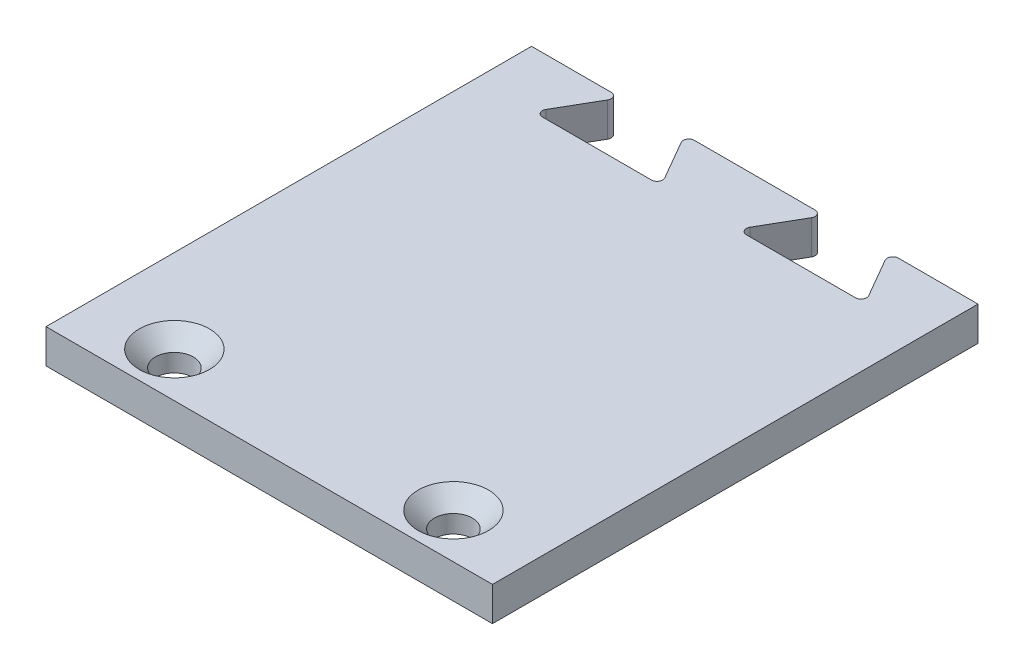
ISO-10303-21;
HEADER;
FILE_DESCRIPTION(('STEP AP214'),'2;1');
FILE_NAME('part.step','',(''),(''),'','','');
FILE_SCHEMA(('AUTOMOTIVE_DESIGN { 1 0 10303 214 1 1 1 1 }'));
ENDSEC;
DATA;
#1=APPLICATION_CONTEXT('core data for automotive mechanical design processes');
#2=APPLICATION_PROTOCOL_DEFINITION('international standard','automotive_design',2000,#1);
#3=PRODUCT_CONTEXT('',#1,'mechanical');
#4=PRODUCT('Part','Part','',(#3));
#5=PRODUCT_RELATED_PRODUCT_CATEGORY('part','',(#4));
#6=PRODUCT_DEFINITION_FORMATION('','',#4);
#7=PRODUCT_DEFINITION_CONTEXT('part definition',#1,'design');
#8=PRODUCT_DEFINITION('design','',#6,#7);
#9=PRODUCT_DEFINITION_SHAPE('','',#8);
#10=(LENGTH_UNIT() NAMED_UNIT(*) SI_UNIT(.MILLI.,.METRE.));
#11=(NAMED_UNIT(*) PLANE_ANGLE_UNIT() SI_UNIT($,.RADIAN.));
#12=(NAMED_UNIT(*) SI_UNIT($,.STERADIAN.) SOLID_ANGLE_UNIT());
#13=UNCERTAINTY_MEASURE_WITH_UNIT(LENGTH_MEASURE(1.E-05),#10,'distance_accuracy_value','');
#14=(GEOMETRIC_REPRESENTATION_CONTEXT(3) GLOBAL_UNCERTAINTY_ASSIGNED_CONTEXT((#13)) GLOBAL_UNIT_ASSIGNED_CONTEXT((#10,
#11,#12)) REPRESENTATION_CONTEXT('',''));
#15=CARTESIAN_POINT('',(0.,0.,0.));
#16=DIRECTION('',(0.,0.,1.));
#17=DIRECTION('',(1.,0.,0.));
#18=AXIS2_PLACEMENT_3D('',#15,#16,#17);
#19=CARTESIAN_POINT('',(0.,3.05,0.));
#20=DIRECTION('',(0.,-1.,0.));
#21=DIRECTION('',(0.,0.,-1.));
#22=AXIS2_PLACEMENT_3D('',#19,#20,#21);
#23=PLANE('',#22);
#24=CARTESIAN_POINT('',(7.5,3.05,-4.));
#25=DIRECTION('',(0.,1.,0.));
#26=DIRECTION('',(0.,0.,1.));
#27=AXIS2_PLACEMENT_3D('',#24,#25,#26);
#28=CIRCLE('',#27,3.15);
#29=CARTESIAN_POINT('',(7.5,3.05,-0.850000000000004));
#30=VERTEX_POINT('',#29);
#31=EDGE_CURVE('E614',#30,#30,#28,.T.);
#32=ORIENTED_EDGE('',*,*,#31,.F.);
#33=EDGE_LOOP('',(#32));
#34=FACE_BOUND('',#33,.T.);
#35=DIRECTION('',(-1.,0.,0.));
#36=VECTOR('',#35,1.);
#37=CARTESIAN_POINT('',(32.,3.05,-43.5));
#38=LINE('',#37,#36);
#39=CARTESIAN_POINT('',(40.,3.05,-43.5));
#40=VERTEX_POINT('',#39);
#41=CARTESIAN_POINT('',(32.8660254037844,3.05,-43.5));
#42=VERTEX_POINT('',#41);
#43=EDGE_CURVE('E185',#40,#42,#38,.T.);
#44=ORIENTED_EDGE('',*,*,#43,.T.);
#45=CARTESIAN_POINT('',(32.8660254037844,3.05,-43.));
#46=DIRECTION('',(0.,-1.,0.));
#47=DIRECTION('',(0.,0.,-1.));
#48=AXIS2_PLACEMENT_3D('',#45,#46,#47);
#49=CIRCLE('',#48,0.5);
#50=CARTESIAN_POINT('',(32.4330127018922,3.05,-42.75));
#51=VERTEX_POINT('',#50);
#52=EDGE_CURVE('E230',#42,#51,#49,.F.);
#53=ORIENTED_EDGE('',*,*,#52,.T.);
#54=DIRECTION('',(0.500000000000005,0.,0.866025403784436));
#55=VECTOR('',#54,1.);
#56=CARTESIAN_POINT('',(34.8867513459482,3.05,-38.5));
#57=LINE('',#56,#55);
#58=CARTESIAN_POINT('',(34.4537386440559,3.05,-39.25));
#59=VERTEX_POINT('',#58);
#60=EDGE_CURVE('E339',#51,#59,#57,.T.);
#61=ORIENTED_EDGE('',*,*,#60,.T.);
#62=CARTESIAN_POINT('',(34.0207259421637,3.05,-39.));
#63=DIRECTION('',(0.,-1.,0.));
#64=DIRECTION('',(0.,0.,-1.));
#65=AXIS2_PLACEMENT_3D('',#62,#63,#64);
#66=CIRCLE('',#65,0.5);
#67=CARTESIAN_POINT('',(34.0207259421637,3.05,-38.5));
#68=VERTEX_POINT('',#67);
#69=EDGE_CURVE('E261',#59,#68,#66,.T.);
#70=ORIENTED_EDGE('',*,*,#69,.T.);
#71=DIRECTION('',(-1.,0.,0.));
#72=VECTOR('',#71,1.);
#73=CARTESIAN_POINT('',(23.3867513459482,3.05,-38.5));
#74=LINE('',#73,#72);
#75=CARTESIAN_POINT('',(24.2527767497326,3.05,-38.5));
#76=VERTEX_POINT('',#75);
#77=EDGE_CURVE('E342',#68,#76,#74,.T.);
#78=ORIENTED_EDGE('',*,*,#77,.T.);
#79=CARTESIAN_POINT('',(24.2527767497326,3.05,-39.));
#80=DIRECTION('',(0.,-1.,0.));
#81=DIRECTION('',(0.,0.,-1.));
#82=AXIS2_PLACEMENT_3D('',#79,#80,#81);
#83=CIRCLE('',#82,0.5);
#84=CARTESIAN_POINT('',(23.8197640478404,3.05,-39.25));
#85=VERTEX_POINT('',#84);
#86=EDGE_CURVE('E265',#76,#85,#83,.T.);
#87=ORIENTED_EDGE('',*,*,#86,.T.);
#88=DIRECTION('',(0.500000000000004,0.,-0.866025403784437));
#89=VECTOR('',#88,1.);
#90=CARTESIAN_POINT('',(26.2735026918963,3.05,-43.5));
#91=LINE('',#90,#89);
#92=CARTESIAN_POINT('',(25.8404899900041,3.05,-42.75));
#93=VERTEX_POINT('',#92);
#94=EDGE_CURVE('E347',#85,#93,#91,.T.);
#95=ORIENTED_EDGE('',*,*,#94,.T.);
#96=CARTESIAN_POINT('',(25.4074772881119,3.05,-43.));
#97=DIRECTION('',(0.,-1.,0.));
#98=DIRECTION('',(0.,0.,-1.));
#99=AXIS2_PLACEMENT_3D('',#96,#97,#98);
#100=CIRCLE('',#99,0.5);
#101=CARTESIAN_POINT('',(25.4074772881119,3.05,-43.5));
#102=VERTEX_POINT('',#101);
#103=EDGE_CURVE('E228',#93,#102,#100,.F.);
#104=ORIENTED_EDGE('',*,*,#103,.T.);
#105=DIRECTION('',(-1.,0.,0.));
#106=VECTOR('',#105,1.);
#107=CARTESIAN_POINT('',(13.7264973081037,3.05,-43.5));
#108=LINE('',#107,#106);
#109=CARTESIAN_POINT('',(14.5925227118881,3.05,-43.5));
#110=VERTEX_POINT('',#109);
#111=EDGE_CURVE('E350',#102,#110,#108,.T.);
#112=ORIENTED_EDGE('',*,*,#111,.T.);
#113=CARTESIAN_POINT('',(14.5925227118881,3.05,-43.));
#114=DIRECTION('',(0.,-1.,0.));
#115=DIRECTION('',(0.,0.,-1.));
#116=AXIS2_PLACEMENT_3D('',#113,#114,#115);
#117=CIRCLE('',#116,0.5);
#118=CARTESIAN_POINT('',(14.1595100099959,3.05,-42.75));
#119=VERTEX_POINT('',#118);
#120=EDGE_CURVE('E226',#110,#119,#117,.F.);
#121=ORIENTED_EDGE('',*,*,#120,.T.);
#122=DIRECTION('',(0.500000000000004,0.,0.866025403784437));
#123=VECTOR('',#122,1.);
#124=CARTESIAN_POINT('',(16.6132486540518,3.05,-38.5));
#125=LINE('',#124,#123);
#126=CARTESIAN_POINT('',(16.1802359521596,3.05,-39.25));
#127=VERTEX_POINT('',#126);
#128=EDGE_CURVE('E296',#119,#127,#125,.T.);
#129=ORIENTED_EDGE('',*,*,#128,.T.);
#130=CARTESIAN_POINT('',(15.7472232502674,3.05,-39.));
#131=DIRECTION('',(0.,-1.,0.));
#132=DIRECTION('',(0.,0.,-1.));
#133=AXIS2_PLACEMENT_3D('',#130,#131,#132);
#134=CIRCLE('',#133,0.5);
#135=CARTESIAN_POINT('',(15.7472232502674,3.05,-38.5));
#136=VERTEX_POINT('',#135);
#137=EDGE_CURVE('E269',#127,#136,#134,.T.);
#138=ORIENTED_EDGE('',*,*,#137,.T.);
#139=DIRECTION('',(-1.,0.,0.));
#140=VECTOR('',#139,1.);
#141=CARTESIAN_POINT('',(5.11324865405184,3.05,-38.5));
#142=LINE('',#141,#140);
#143=CARTESIAN_POINT('',(5.97927405783628,3.05,-38.5));
#144=VERTEX_POINT('',#143);
#145=EDGE_CURVE('E291',#136,#144,#142,.T.);
#146=ORIENTED_EDGE('',*,*,#145,.T.);
#147=CARTESIAN_POINT('',(5.97927405783628,3.05,-39.));
#148=DIRECTION('',(0.,-1.,0.));
#149=DIRECTION('',(0.,0.,-1.));
#150=AXIS2_PLACEMENT_3D('',#147,#148,#149);
#151=CIRCLE('',#150,0.5);
#152=CARTESIAN_POINT('',(5.54626135594407,3.05,-39.25));
#153=VERTEX_POINT('',#152);
#154=EDGE_CURVE('E11',#144,#153,#151,.T.);
#155=ORIENTED_EDGE('',*,*,#154,.T.);
#156=DIRECTION('',(0.500000000000004,0.,-0.866025403784436));
#157=VECTOR('',#156,1.);
#158=CARTESIAN_POINT('',(8.,3.05,-43.5));
#159=LINE('',#158,#157);
#160=CARTESIAN_POINT('',(7.56698729810778,3.05,-42.75));
#161=VERTEX_POINT('',#160);
#162=EDGE_CURVE('E290',#153,#161,#159,.T.);
#163=ORIENTED_EDGE('',*,*,#162,.T.);
#164=CARTESIAN_POINT('',(7.13397459621556,3.05,-43.));
#165=DIRECTION('',(0.,-1.,0.));
#166=DIRECTION('',(0.,0.,-1.));
#167=AXIS2_PLACEMENT_3D('',#164,#165,#166);
#168=CIRCLE('',#167,0.5);
#169=CARTESIAN_POINT('',(7.13397459621556,3.05,-43.5));
#170=VERTEX_POINT('',#169);
#171=EDGE_CURVE('E52',#161,#170,#168,.F.);
#172=ORIENTED_EDGE('',*,*,#171,.T.);
#173=DIRECTION('',(-1.,0.,0.));
#174=VECTOR('',#173,1.);
#175=CARTESIAN_POINT('',(0.,3.05,-43.5));
#176=LINE('',#175,#174);
#177=CARTESIAN_POINT('',(0.,3.05,-43.5));
#178=VERTEX_POINT('',#177);
#179=EDGE_CURVE('E293',#170,#178,#176,.T.);
#180=ORIENTED_EDGE('',*,*,#179,.T.);
#181=DIRECTION('',(0.,0.,1.));
#182=VECTOR('',#181,1.);
#183=CARTESIAN_POINT('',(0.,3.05,0.));
#184=LINE('',#183,#182);
#185=CARTESIAN_POINT('',(0.,3.05,0.));
#186=VERTEX_POINT('',#185);
#187=EDGE_CURVE('E191',#178,#186,#184,.T.);
#188=ORIENTED_EDGE('',*,*,#187,.T.);
#189=DIRECTION('',(1.,0.,0.));
#190=VECTOR('',#189,1.);
#191=CARTESIAN_POINT('',(40.,3.05,0.));
#192=LINE('',#191,#190);
#193=CARTESIAN_POINT('',(40.,3.05,0.));
#194=VERTEX_POINT('',#193);
#195=EDGE_CURVE('E186',#186,#194,#192,.T.);
#196=ORIENTED_EDGE('',*,*,#195,.T.);
#197=DIRECTION('',(0.,0.,-1.));
#198=VECTOR('',#197,1.);
#199=CARTESIAN_POINT('',(40.,3.05,-43.5));
#200=LINE('',#199,#198);
#201=EDGE_CURVE('E175',#194,#40,#200,.T.);
#202=ORIENTED_EDGE('',*,*,#201,.T.);
#203=EDGE_LOOP('',(#44,#53,#61,#70,#78,#87,#95,#104,#112,#121,#129,#138,#146,#155,#163,#172,
#180,#188,#196,#202));
#204=FACE_BOUND('',#203,.T.);
#205=CARTESIAN_POINT('',(32.5,3.05,-4.));
#206=DIRECTION('',(0.,1.,0.));
#207=DIRECTION('',(0.,0.,1.));
#208=AXIS2_PLACEMENT_3D('',#205,#206,#207);
#209=CIRCLE('',#208,3.15);
#210=CARTESIAN_POINT('',(32.5,3.05,-0.85));
#211=VERTEX_POINT('',#210);
#212=EDGE_CURVE('E621',#211,#211,#209,.T.);
#213=ORIENTED_EDGE('',*,*,#212,.F.);
#214=EDGE_LOOP('',(#213));
#215=FACE_BOUND('',#214,.T.);
#216=ADVANCED_FACE('F37',(#34,#204,#215),#23,.F.);
#217=CARTESIAN_POINT('',(40.,3.05,0.));
#218=DIRECTION('',(0.,0.,-1.));
#219=DIRECTION('',(-1.,0.,0.));
#220=AXIS2_PLACEMENT_3D('',#217,#218,#219);
#221=PLANE('',#220);
#222=DIRECTION('',(1.,0.,0.));
#223=VECTOR('',#222,1.);
#224=CARTESIAN_POINT('',(40.,0.,0.));
#225=LINE('',#224,#223);
#226=CARTESIAN_POINT('',(0.,0.,0.));
#227=VERTEX_POINT('',#226);
#228=CARTESIAN_POINT('',(40.,0.,0.));
#229=VERTEX_POINT('',#228);
#230=EDGE_CURVE('E199',#227,#229,#225,.T.);
#231=ORIENTED_EDGE('',*,*,#230,.T.);
#232=DIRECTION('',(0.,-1.,0.));
#233=VECTOR('',#232,1.);
#234=CARTESIAN_POINT('',(40.,3.05,0.));
#235=LINE('',#234,#233);
#236=EDGE_CURVE('E179',#194,#229,#235,.T.);
#237=ORIENTED_EDGE('',*,*,#236,.F.);
#238=ORIENTED_EDGE('',*,*,#195,.F.);
#239=DIRECTION('',(0.,-1.,0.));
#240=VECTOR('',#239,1.);
#241=CARTESIAN_POINT('',(0.,3.05,0.));
#242=LINE('',#241,#240);
#243=EDGE_CURVE('E301',#186,#227,#242,.T.);
#244=ORIENTED_EDGE('',*,*,#243,.T.);
#245=EDGE_LOOP('',(#231,#237,#238,#244));
#246=FACE_BOUND('',#245,.T.);
#247=ADVANCED_FACE('F197',(#246),#221,.F.);
#248=CARTESIAN_POINT('',(40.,3.05,-43.5));
#249=DIRECTION('',(-1.,0.,0.));
#250=DIRECTION('',(0.,0.,1.));
#251=AXIS2_PLACEMENT_3D('',#248,#249,#250);
#252=PLANE('',#251);
#253=DIRECTION('',(0.,0.,-1.));
#254=VECTOR('',#253,1.);
#255=CARTESIAN_POINT('',(40.,0.,-43.5));
#256=LINE('',#255,#254);
#257=CARTESIAN_POINT('',(40.,0.,-43.5));
#258=VERTEX_POINT('',#257);
#259=EDGE_CURVE('E303',#229,#258,#256,.T.);
#260=ORIENTED_EDGE('',*,*,#259,.T.);
#261=DIRECTION('',(0.,-1.,0.));
#262=VECTOR('',#261,1.);
#263=CARTESIAN_POINT('',(40.,3.05,-43.5));
#264=LINE('',#263,#262);
#265=EDGE_CURVE('E182',#40,#258,#264,.T.);
#266=ORIENTED_EDGE('',*,*,#265,.F.);
#267=ORIENTED_EDGE('',*,*,#201,.F.);
#268=ORIENTED_EDGE('',*,*,#236,.T.);
#269=EDGE_LOOP('',(#260,#266,#267,#268));
#270=FACE_BOUND('',#269,.T.);
#271=ADVANCED_FACE('F177',(#270),#252,.F.);
#272=CARTESIAN_POINT('',(32.,3.05,-43.5));
#273=DIRECTION('',(0.,0.,1.));
#274=DIRECTION('',(1.,0.,0.));
#275=AXIS2_PLACEMENT_3D('',#272,#273,#274);
#276=PLANE('',#275);
#277=DIRECTION('',(-1.,0.,0.));
#278=VECTOR('',#277,1.);
#279=CARTESIAN_POINT('',(32.,0.,-43.5));
#280=LINE('',#279,#278);
#281=CARTESIAN_POINT('',(32.8660254037844,0.,-43.5));
#282=VERTEX_POINT('',#281);
#283=EDGE_CURVE('E306',#258,#282,#280,.T.);
#284=ORIENTED_EDGE('',*,*,#283,.T.);
#285=DIRECTION('',(0.,-1.,0.));
#286=VECTOR('',#285,1.);
#287=CARTESIAN_POINT('',(32.8660254037844,3.05,-43.5));
#288=LINE('',#287,#286);
#289=EDGE_CURVE('E223',#282,#42,#288,.F.);
#290=ORIENTED_EDGE('',*,*,#289,.T.);
#291=ORIENTED_EDGE('',*,*,#43,.F.);
#292=ORIENTED_EDGE('',*,*,#265,.T.);
#293=EDGE_LOOP('',(#284,#290,#291,#292));
#294=FACE_BOUND('',#293,.T.);
#295=ADVANCED_FACE('F336',(#294),#276,.F.);
#296=CARTESIAN_POINT('',(34.8867513459482,3.05,-38.5));
#297=DIRECTION('',(0.866025403784436,0.,-0.500000000000005));
#298=DIRECTION('',(-0.500000000000005,0.,-0.866025403784436));
#299=AXIS2_PLACEMENT_3D('',#296,#297,#298);
#300=PLANE('',#299);
#301=DIRECTION('',(0.500000000000005,0.,0.866025403784436));
#302=VECTOR('',#301,1.);
#303=CARTESIAN_POINT('',(34.8867513459482,0.,-38.5));
#304=LINE('',#303,#302);
#305=CARTESIAN_POINT('',(32.4330127018922,0.,-42.75));
#306=VERTEX_POINT('',#305);
#307=CARTESIAN_POINT('',(34.4537386440559,0.,-39.25));
#308=VERTEX_POINT('',#307);
#309=EDGE_CURVE('E309',#306,#308,#304,.T.);
#310=ORIENTED_EDGE('',*,*,#309,.T.);
#311=DIRECTION('',(0.,-1.,0.));
#312=VECTOR('',#311,1.);
#313=CARTESIAN_POINT('',(34.4537386440559,3.05,-39.25));
#314=LINE('',#313,#312);
#315=EDGE_CURVE('E213',#308,#59,#314,.F.);
#316=ORIENTED_EDGE('',*,*,#315,.T.);
#317=ORIENTED_EDGE('',*,*,#60,.F.);
#318=DIRECTION('',(0.,-1.,0.));
#319=VECTOR('',#318,1.);
#320=CARTESIAN_POINT('',(32.4330127018922,3.05,-42.75));
#321=LINE('',#320,#319);
#322=EDGE_CURVE('E210',#51,#306,#321,.T.);
#323=ORIENTED_EDGE('',*,*,#322,.T.);
#324=EDGE_LOOP('',(#310,#316,#317,#323));
#325=FACE_BOUND('',#324,.T.);
#326=ADVANCED_FACE('F394',(#325),#300,.F.);
#327=CARTESIAN_POINT('',(23.3867513459482,3.05,-38.5));
#328=DIRECTION('',(0.,0.,1.));
#329=DIRECTION('',(1.,0.,0.));
#330=AXIS2_PLACEMENT_3D('',#327,#328,#329);
#331=PLANE('',#330);
#332=ORIENTED_EDGE('',*,*,#77,.F.);
#333=DIRECTION('',(0.,-1.,0.));
#334=VECTOR('',#333,1.);
#335=CARTESIAN_POINT('',(34.0207259421637,0.,-38.5));
#336=LINE('',#335,#334);
#337=CARTESIAN_POINT('',(34.0207259421637,0.,-38.5));
#338=VERTEX_POINT('',#337);
#339=EDGE_CURVE('E202',#68,#338,#336,.T.);
#340=ORIENTED_EDGE('',*,*,#339,.T.);
#341=DIRECTION('',(-1.,0.,0.));
#342=VECTOR('',#341,1.);
#343=CARTESIAN_POINT('',(23.3867513459482,0.,-38.5));
#344=LINE('',#343,#342);
#345=CARTESIAN_POINT('',(24.2527767497326,0.,-38.5));
#346=VERTEX_POINT('',#345);
#347=EDGE_CURVE('E312',#338,#346,#344,.T.);
#348=ORIENTED_EDGE('',*,*,#347,.T.);
#349=DIRECTION('',(0.,-1.,0.));
#350=VECTOR('',#349,1.);
#351=CARTESIAN_POINT('',(24.2527767497326,3.05,-38.5));
#352=LINE('',#351,#350);
#353=EDGE_CURVE('E200',#346,#76,#352,.F.);
#354=ORIENTED_EDGE('',*,*,#353,.T.);
#355=EDGE_LOOP('',(#332,#340,#348,#354));
#356=FACE_BOUND('',#355,.T.);
#357=ADVANCED_FACE('F387',(#356),#331,.F.);
#358=CARTESIAN_POINT('',(26.2735026918963,3.05,-43.5));
#359=DIRECTION('',(-0.866025403784437,0.,-0.500000000000004));
#360=DIRECTION('',(-0.500000000000004,0.,0.866025403784437));
#361=AXIS2_PLACEMENT_3D('',#358,#359,#360);
#362=PLANE('',#361);
#363=ORIENTED_EDGE('',*,*,#94,.F.);
#364=DIRECTION('',(0.,-1.,0.));
#365=VECTOR('',#364,1.);
#366=CARTESIAN_POINT('',(23.8197640478404,0.,-39.25));
#367=LINE('',#366,#365);
#368=CARTESIAN_POINT('',(23.8197640478404,0.,-39.25));
#369=VERTEX_POINT('',#368);
#370=EDGE_CURVE('E234',#85,#369,#367,.T.);
#371=ORIENTED_EDGE('',*,*,#370,.T.);
#372=DIRECTION('',(0.500000000000004,0.,-0.866025403784437));
#373=VECTOR('',#372,1.);
#374=CARTESIAN_POINT('',(26.2735026918963,0.,-43.5));
#375=LINE('',#374,#373);
#376=CARTESIAN_POINT('',(25.8404899900041,0.,-42.75));
#377=VERTEX_POINT('',#376);
#378=EDGE_CURVE('E315',#369,#377,#375,.T.);
#379=ORIENTED_EDGE('',*,*,#378,.T.);
#380=DIRECTION('',(0.,-1.,0.));
#381=VECTOR('',#380,1.);
#382=CARTESIAN_POINT('',(25.8404899900041,3.05,-42.75));
#383=LINE('',#382,#381);
#384=EDGE_CURVE('E232',#377,#93,#383,.F.);
#385=ORIENTED_EDGE('',*,*,#384,.T.);
#386=EDGE_LOOP('',(#363,#371,#379,#385));
#387=FACE_BOUND('',#386,.T.);
#388=ADVANCED_FACE('F378',(#387),#362,.F.);
#389=CARTESIAN_POINT('',(13.7264973081037,3.05,-43.5));
#390=DIRECTION('',(0.,0.,1.));
#391=DIRECTION('',(1.,0.,0.));
#392=AXIS2_PLACEMENT_3D('',#389,#390,#391);
#393=PLANE('',#392);
#394=ORIENTED_EDGE('',*,*,#111,.F.);
#395=DIRECTION('',(0.,-1.,0.));
#396=VECTOR('',#395,1.);
#397=CARTESIAN_POINT('',(25.4074772881119,3.05,-43.5));
#398=LINE('',#397,#396);
#399=CARTESIAN_POINT('',(25.4074772881119,0.,-43.5));
#400=VERTEX_POINT('',#399);
#401=EDGE_CURVE('E239',#102,#400,#398,.T.);
#402=ORIENTED_EDGE('',*,*,#401,.T.);
#403=DIRECTION('',(-1.,0.,0.));
#404=VECTOR('',#403,1.);
#405=CARTESIAN_POINT('',(13.7264973081037,0.,-43.5));
#406=LINE('',#405,#404);
#407=CARTESIAN_POINT('',(14.5925227118881,0.,-43.5));
#408=VERTEX_POINT('',#407);
#409=EDGE_CURVE('E318',#400,#408,#406,.T.);
#410=ORIENTED_EDGE('',*,*,#409,.T.);
#411=DIRECTION('',(0.,-1.,0.));
#412=VECTOR('',#411,1.);
#413=CARTESIAN_POINT('',(14.5925227118881,3.05,-43.5));
#414=LINE('',#413,#412);
#415=EDGE_CURVE('E237',#408,#110,#414,.F.);
#416=ORIENTED_EDGE('',*,*,#415,.T.);
#417=EDGE_LOOP('',(#394,#402,#410,#416));
#418=FACE_BOUND('',#417,.T.);
#419=ADVANCED_FACE('F369',(#418),#393,.F.);
#420=CARTESIAN_POINT('',(16.6132486540518,3.05,-38.5));
#421=DIRECTION('',(0.866025403784436,0.,-0.500000000000004));
#422=DIRECTION('',(-0.500000000000004,0.,-0.866025403784437));
#423=AXIS2_PLACEMENT_3D('',#420,#421,#422);
#424=PLANE('',#423);
#425=ORIENTED_EDGE('',*,*,#128,.F.);
#426=DIRECTION('',(0.,-1.,0.));
#427=VECTOR('',#426,1.);
#428=CARTESIAN_POINT('',(14.1595100099959,3.05,-42.75));
#429=LINE('',#428,#427);
#430=CARTESIAN_POINT('',(14.1595100099959,0.,-42.75));
#431=VERTEX_POINT('',#430);
#432=EDGE_CURVE('E244',#119,#431,#429,.T.);
#433=ORIENTED_EDGE('',*,*,#432,.T.);
#434=DIRECTION('',(0.500000000000004,0.,0.866025403784437));
#435=VECTOR('',#434,1.);
#436=CARTESIAN_POINT('',(16.6132486540518,0.,-38.5));
#437=LINE('',#436,#435);
#438=CARTESIAN_POINT('',(16.1802359521596,0.,-39.25));
#439=VERTEX_POINT('',#438);
#440=EDGE_CURVE('E286',#431,#439,#437,.T.);
#441=ORIENTED_EDGE('',*,*,#440,.T.);
#442=DIRECTION('',(0.,-1.,0.));
#443=VECTOR('',#442,1.);
#444=CARTESIAN_POINT('',(16.1802359521596,3.05,-39.25));
#445=LINE('',#444,#443);
#446=EDGE_CURVE('E242',#439,#127,#445,.F.);
#447=ORIENTED_EDGE('',*,*,#446,.T.);
#448=EDGE_LOOP('',(#425,#433,#441,#447));
#449=FACE_BOUND('',#448,.T.);
#450=ADVANCED_FACE('F362',(#449),#424,.F.);
#451=CARTESIAN_POINT('',(5.11324865405184,3.05,-38.5));
#452=DIRECTION('',(0.,0.,1.));
#453=DIRECTION('',(1.,0.,0.));
#454=AXIS2_PLACEMENT_3D('',#451,#452,#453);
#455=PLANE('',#454);
#456=ORIENTED_EDGE('',*,*,#145,.F.);
#457=DIRECTION('',(0.,-1.,0.));
#458=VECTOR('',#457,1.);
#459=CARTESIAN_POINT('',(15.7472232502674,0.,-38.5));
#460=LINE('',#459,#458);
#461=CARTESIAN_POINT('',(15.7472232502674,0.,-38.5));
#462=VERTEX_POINT('',#461);
#463=EDGE_CURVE('E249',#136,#462,#460,.T.);
#464=ORIENTED_EDGE('',*,*,#463,.T.);
#465=DIRECTION('',(-1.,0.,0.));
#466=VECTOR('',#465,1.);
#467=CARTESIAN_POINT('',(5.11324865405184,0.,-38.5));
#468=LINE('',#467,#466);
#469=CARTESIAN_POINT('',(5.97927405783628,0.,-38.5));
#470=VERTEX_POINT('',#469);
#471=EDGE_CURVE('E276',#462,#470,#468,.T.);
#472=ORIENTED_EDGE('',*,*,#471,.T.);
#473=DIRECTION('',(0.,-1.,0.));
#474=VECTOR('',#473,1.);
#475=CARTESIAN_POINT('',(5.97927405783628,3.05,-38.5));
#476=LINE('',#475,#474);
#477=EDGE_CURVE('E247',#470,#144,#476,.F.);
#478=ORIENTED_EDGE('',*,*,#477,.T.);
#479=EDGE_LOOP('',(#456,#464,#472,#478));
#480=FACE_BOUND('',#479,.T.);
#481=ADVANCED_FACE('F283',(#480),#455,.F.);
#482=CARTESIAN_POINT('',(8.,3.05,-43.5));
#483=DIRECTION('',(-0.866025403784436,0.,-0.500000000000004));
#484=DIRECTION('',(-0.500000000000004,0.,0.866025403784436));
#485=AXIS2_PLACEMENT_3D('',#482,#483,#484);
#486=PLANE('',#485);
#487=ORIENTED_EDGE('',*,*,#162,.F.);
#488=DIRECTION('',(0.,-1.,0.));
#489=VECTOR('',#488,1.);
#490=CARTESIAN_POINT('',(5.54626135594407,0.,-39.25));
#491=LINE('',#490,#489);
#492=CARTESIAN_POINT('',(5.54626135594407,0.,-39.25));
#493=VERTEX_POINT('',#492);
#494=EDGE_CURVE('E253',#153,#493,#491,.T.);
#495=ORIENTED_EDGE('',*,*,#494,.T.);
#496=DIRECTION('',(0.500000000000004,0.,-0.866025403784436));
#497=VECTOR('',#496,1.);
#498=CARTESIAN_POINT('',(8.,0.,-43.5));
#499=LINE('',#498,#497);
#500=CARTESIAN_POINT('',(7.56698729810778,0.,-42.75));
#501=VERTEX_POINT('',#500);
#502=EDGE_CURVE('E277',#493,#501,#499,.T.);
#503=ORIENTED_EDGE('',*,*,#502,.T.);
#504=DIRECTION('',(0.,-1.,0.));
#505=VECTOR('',#504,1.);
#506=CARTESIAN_POINT('',(7.56698729810778,3.05,-42.75));
#507=LINE('',#506,#505);
#508=EDGE_CURVE('E60',#501,#161,#507,.F.);
#509=ORIENTED_EDGE('',*,*,#508,.T.);
#510=EDGE_LOOP('',(#487,#495,#503,#509));
#511=FACE_BOUND('',#510,.T.);
#512=ADVANCED_FACE('F292',(#511),#486,.F.);
#513=CARTESIAN_POINT('',(0.,3.05,-43.5));
#514=DIRECTION('',(0.,0.,1.));
#515=DIRECTION('',(1.,0.,0.));
#516=AXIS2_PLACEMENT_3D('',#513,#514,#515);
#517=PLANE('',#516);
#518=ORIENTED_EDGE('',*,*,#179,.F.);
#519=DIRECTION('',(0.,-1.,0.));
#520=VECTOR('',#519,1.);
#521=CARTESIAN_POINT('',(7.13397459621556,3.05,-43.5));
#522=LINE('',#521,#520);
#523=CARTESIAN_POINT('',(7.13397459621556,0.,-43.5));
#524=VERTEX_POINT('',#523);
#525=EDGE_CURVE('E256',#170,#524,#522,.T.);
#526=ORIENTED_EDGE('',*,*,#525,.T.);
#527=DIRECTION('',(-1.,0.,0.));
#528=VECTOR('',#527,1.);
#529=CARTESIAN_POINT('',(0.,0.,-43.5));
#530=LINE('',#529,#528);
#531=CARTESIAN_POINT('',(0.,0.,-43.5));
#532=VERTEX_POINT('',#531);
#533=EDGE_CURVE('E324',#524,#532,#530,.T.);
#534=ORIENTED_EDGE('',*,*,#533,.T.);
#535=DIRECTION('',(0.,-1.,0.));
#536=VECTOR('',#535,1.);
#537=CARTESIAN_POINT('',(0.,3.05,-43.5));
#538=LINE('',#537,#536);
#539=EDGE_CURVE('E204',#178,#532,#538,.T.);
#540=ORIENTED_EDGE('',*,*,#539,.F.);
#541=EDGE_LOOP('',(#518,#526,#534,#540));
#542=FACE_BOUND('',#541,.T.);
#543=ADVANCED_FACE('F424',(#542),#517,.F.);
#544=CARTESIAN_POINT('',(0.,3.05,0.));
#545=DIRECTION('',(1.,0.,0.));
#546=DIRECTION('',(0.,0.,-1.));
#547=AXIS2_PLACEMENT_3D('',#544,#545,#546);
#548=PLANE('',#547);
#549=DIRECTION('',(0.,0.,1.));
#550=VECTOR('',#549,1.);
#551=CARTESIAN_POINT('',(0.,0.,0.));
#552=LINE('',#551,#550);
#553=EDGE_CURVE('E195',#532,#227,#552,.T.);
#554=ORIENTED_EDGE('',*,*,#553,.T.);
#555=ORIENTED_EDGE('',*,*,#243,.F.);
#556=ORIENTED_EDGE('',*,*,#187,.F.);
#557=ORIENTED_EDGE('',*,*,#539,.T.);
#558=EDGE_LOOP('',(#554,#555,#556,#557));
#559=FACE_BOUND('',#558,.T.);
#560=ADVANCED_FACE('F331',(#559),#548,.F.);
#561=CARTESIAN_POINT('',(0.,0.,0.));
#562=DIRECTION('',(0.,-1.,0.));
#563=DIRECTION('',(0.,0.,-1.));
#564=AXIS2_PLACEMENT_3D('',#561,#562,#563);
#565=PLANE('',#564);
#566=CARTESIAN_POINT('',(7.5,0.,-4.));
#567=DIRECTION('',(0.,1.,0.));
#568=DIRECTION('',(0.,0.,1.));
#569=AXIS2_PLACEMENT_3D('',#566,#567,#568);
#570=CIRCLE('',#569,1.7);
#571=CARTESIAN_POINT('',(7.5,0.,-2.30000000000001));
#572=VERTEX_POINT('',#571);
#573=EDGE_CURVE('E616',#572,#572,#570,.T.);
#574=ORIENTED_EDGE('',*,*,#573,.T.);
#575=EDGE_LOOP('',(#574));
#576=FACE_BOUND('',#575,.T.);
#577=CARTESIAN_POINT('',(32.5,0.,-4.));
#578=DIRECTION('',(0.,1.,0.));
#579=DIRECTION('',(0.,0.,1.));
#580=AXIS2_PLACEMENT_3D('',#577,#578,#579);
#581=CIRCLE('',#580,1.7);
#582=CARTESIAN_POINT('',(32.5,0.,-2.3));
#583=VERTEX_POINT('',#582);
#584=EDGE_CURVE('E304',#583,#583,#581,.T.);
#585=ORIENTED_EDGE('',*,*,#584,.T.);
#586=EDGE_LOOP('',(#585));
#587=FACE_BOUND('',#586,.T.);
#588=ORIENTED_EDGE('',*,*,#309,.F.);
#589=CARTESIAN_POINT('',(32.8660254037844,0.,-43.));
#590=DIRECTION('',(0.,-1.,0.));
#591=DIRECTION('',(0.,0.,-1.));
#592=AXIS2_PLACEMENT_3D('',#589,#590,#591);
#593=CIRCLE('',#592,0.5);
#594=EDGE_CURVE('E221',#306,#282,#593,.T.);
#595=ORIENTED_EDGE('',*,*,#594,.T.);
#596=ORIENTED_EDGE('',*,*,#283,.F.);
#597=ORIENTED_EDGE('',*,*,#259,.F.);
#598=ORIENTED_EDGE('',*,*,#230,.F.);
#599=ORIENTED_EDGE('',*,*,#553,.F.);
#600=ORIENTED_EDGE('',*,*,#533,.F.);
#601=CARTESIAN_POINT('',(7.13397459621556,0.,-43.));
#602=DIRECTION('',(0.,-1.,0.));
#603=DIRECTION('',(0.,0.,-1.));
#604=AXIS2_PLACEMENT_3D('',#601,#602,#603);
#605=CIRCLE('',#604,0.5);
#606=EDGE_CURVE('E215',#524,#501,#605,.T.);
#607=ORIENTED_EDGE('',*,*,#606,.T.);
#608=ORIENTED_EDGE('',*,*,#502,.F.);
#609=CARTESIAN_POINT('',(5.97927405783628,0.,-39.));
#610=DIRECTION('',(0.,-1.,0.));
#611=DIRECTION('',(0.,0.,-1.));
#612=AXIS2_PLACEMENT_3D('',#609,#610,#611);
#613=CIRCLE('',#612,0.5);
#614=EDGE_CURVE('E45',#493,#470,#613,.F.);
#615=ORIENTED_EDGE('',*,*,#614,.T.);
#616=ORIENTED_EDGE('',*,*,#471,.F.);
#617=CARTESIAN_POINT('',(15.7472232502674,0.,-39.));
#618=DIRECTION('',(0.,-1.,0.));
#619=DIRECTION('',(0.,0.,-1.));
#620=AXIS2_PLACEMENT_3D('',#617,#618,#619);
#621=CIRCLE('',#620,0.5);
#622=EDGE_CURVE('E267',#462,#439,#621,.F.);
#623=ORIENTED_EDGE('',*,*,#622,.T.);
#624=ORIENTED_EDGE('',*,*,#440,.F.);
#625=CARTESIAN_POINT('',(14.5925227118881,0.,-43.));
#626=DIRECTION('',(0.,-1.,0.));
#627=DIRECTION('',(0.,0.,-1.));
#628=AXIS2_PLACEMENT_3D('',#625,#626,#627);
#629=CIRCLE('',#628,0.5);
#630=EDGE_CURVE('E217',#431,#408,#629,.T.);
#631=ORIENTED_EDGE('',*,*,#630,.T.);
#632=ORIENTED_EDGE('',*,*,#409,.F.);
#633=CARTESIAN_POINT('',(25.4074772881119,0.,-43.));
#634=DIRECTION('',(0.,-1.,0.));
#635=DIRECTION('',(0.,0.,-1.));
#636=AXIS2_PLACEMENT_3D('',#633,#634,#635);
#637=CIRCLE('',#636,0.5);
#638=EDGE_CURVE('E219',#400,#377,#637,.T.);
#639=ORIENTED_EDGE('',*,*,#638,.T.);
#640=ORIENTED_EDGE('',*,*,#378,.F.);
#641=CARTESIAN_POINT('',(24.2527767497326,0.,-39.));
#642=DIRECTION('',(0.,-1.,0.));
#643=DIRECTION('',(0.,0.,-1.));
#644=AXIS2_PLACEMENT_3D('',#641,#642,#643);
#645=CIRCLE('',#644,0.5);
#646=EDGE_CURVE('E263',#369,#346,#645,.F.);
#647=ORIENTED_EDGE('',*,*,#646,.T.);
#648=ORIENTED_EDGE('',*,*,#347,.F.);
#649=CARTESIAN_POINT('',(34.0207259421637,0.,-39.));
#650=DIRECTION('',(0.,-1.,0.));
#651=DIRECTION('',(0.,0.,-1.));
#652=AXIS2_PLACEMENT_3D('',#649,#650,#651);
#653=CIRCLE('',#652,0.5);
#654=EDGE_CURVE('E259',#338,#308,#653,.F.);
#655=ORIENTED_EDGE('',*,*,#654,.T.);
#656=EDGE_LOOP('',(#588,#595,#596,#597,#598,#599,#600,#607,#608,#615,#616,#623,#624,#631,#632,
#639,#640,#647,#648,#655));
#657=FACE_BOUND('',#656,.T.);
#658=ADVANCED_FACE('F275',(#576,#587,#657),#565,.T.);
#659=CARTESIAN_POINT('',(34.0207259421637,3.05,-39.));
#660=DIRECTION('',(0.,1.,0.));
#661=DIRECTION('',(0.,0.,1.));
#662=AXIS2_PLACEMENT_3D('',#659,#660,#661);
#663=CYLINDRICAL_SURFACE('',#662,0.5);
#664=ORIENTED_EDGE('',*,*,#69,.F.);
#665=ORIENTED_EDGE('',*,*,#315,.F.);
#666=ORIENTED_EDGE('',*,*,#654,.F.);
#667=ORIENTED_EDGE('',*,*,#339,.F.);
#668=EDGE_LOOP('',(#664,#665,#666,#667));
#669=FACE_BOUND('',#668,.T.);
#670=ADVANCED_FACE('F391',(#669),#663,.F.);
#671=CARTESIAN_POINT('',(32.8660254037844,3.05,-43.));
#672=DIRECTION('',(0.,-1.,0.));
#673=DIRECTION('',(0.,0.,-1.));
#674=AXIS2_PLACEMENT_3D('',#671,#672,#673);
#675=CYLINDRICAL_SURFACE('',#674,0.5);
#676=ORIENTED_EDGE('',*,*,#52,.F.);
#677=ORIENTED_EDGE('',*,*,#289,.F.);
#678=ORIENTED_EDGE('',*,*,#594,.F.);
#679=ORIENTED_EDGE('',*,*,#322,.F.);
#680=EDGE_LOOP('',(#676,#677,#678,#679));
#681=FACE_BOUND('',#680,.T.);
#682=ADVANCED_FACE('F398',(#681),#675,.T.);
#683=CARTESIAN_POINT('',(24.2527767497326,3.05,-39.));
#684=DIRECTION('',(0.,1.,0.));
#685=DIRECTION('',(0.,0.,1.));
#686=AXIS2_PLACEMENT_3D('',#683,#684,#685);
#687=CYLINDRICAL_SURFACE('',#686,0.5);
#688=ORIENTED_EDGE('',*,*,#86,.F.);
#689=ORIENTED_EDGE('',*,*,#353,.F.);
#690=ORIENTED_EDGE('',*,*,#646,.F.);
#691=ORIENTED_EDGE('',*,*,#370,.F.);
#692=EDGE_LOOP('',(#688,#689,#690,#691));
#693=FACE_BOUND('',#692,.T.);
#694=ADVANCED_FACE('F382',(#693),#687,.F.);
#695=CARTESIAN_POINT('',(25.4074772881119,3.05,-43.));
#696=DIRECTION('',(0.,-1.,0.));
#697=DIRECTION('',(0.,0.,-1.));
#698=AXIS2_PLACEMENT_3D('',#695,#696,#697);
#699=CYLINDRICAL_SURFACE('',#698,0.5);
#700=ORIENTED_EDGE('',*,*,#103,.F.);
#701=ORIENTED_EDGE('',*,*,#384,.F.);
#702=ORIENTED_EDGE('',*,*,#638,.F.);
#703=ORIENTED_EDGE('',*,*,#401,.F.);
#704=EDGE_LOOP('',(#700,#701,#702,#703));
#705=FACE_BOUND('',#704,.T.);
#706=ADVANCED_FACE('F373',(#705),#699,.T.);
#707=CARTESIAN_POINT('',(14.5925227118881,3.05,-43.));
#708=DIRECTION('',(0.,-1.,0.));
#709=DIRECTION('',(0.,0.,-1.));
#710=AXIS2_PLACEMENT_3D('',#707,#708,#709);
#711=CYLINDRICAL_SURFACE('',#710,0.5);
#712=ORIENTED_EDGE('',*,*,#120,.F.);
#713=ORIENTED_EDGE('',*,*,#415,.F.);
#714=ORIENTED_EDGE('',*,*,#630,.F.);
#715=ORIENTED_EDGE('',*,*,#432,.F.);
#716=EDGE_LOOP('',(#712,#713,#714,#715));
#717=FACE_BOUND('',#716,.T.);
#718=ADVANCED_FACE('F364',(#717),#711,.T.);
#719=CARTESIAN_POINT('',(15.7472232502674,3.05,-39.));
#720=DIRECTION('',(0.,1.,0.));
#721=DIRECTION('',(0.,0.,1.));
#722=AXIS2_PLACEMENT_3D('',#719,#720,#721);
#723=CYLINDRICAL_SURFACE('',#722,0.5);
#724=ORIENTED_EDGE('',*,*,#137,.F.);
#725=ORIENTED_EDGE('',*,*,#446,.F.);
#726=ORIENTED_EDGE('',*,*,#622,.F.);
#727=ORIENTED_EDGE('',*,*,#463,.F.);
#728=EDGE_LOOP('',(#724,#725,#726,#727));
#729=FACE_BOUND('',#728,.T.);
#730=ADVANCED_FACE('F360',(#729),#723,.F.);
#731=CARTESIAN_POINT('',(5.97927405783628,3.05,-39.));
#732=DIRECTION('',(0.,1.,0.));
#733=DIRECTION('',(0.,0.,1.));
#734=AXIS2_PLACEMENT_3D('',#731,#732,#733);
#735=CYLINDRICAL_SURFACE('',#734,0.5);
#736=ORIENTED_EDGE('',*,*,#154,.F.);
#737=ORIENTED_EDGE('',*,*,#477,.F.);
#738=ORIENTED_EDGE('',*,*,#614,.F.);
#739=ORIENTED_EDGE('',*,*,#494,.F.);
#740=EDGE_LOOP('',(#736,#737,#738,#739));
#741=FACE_BOUND('',#740,.T.);
#742=ADVANCED_FACE('F289',(#741),#735,.F.);
#743=CARTESIAN_POINT('',(7.13397459621556,3.05,-43.));
#744=DIRECTION('',(0.,-1.,0.));
#745=DIRECTION('',(0.,0.,-1.));
#746=AXIS2_PLACEMENT_3D('',#743,#744,#745);
#747=CYLINDRICAL_SURFACE('',#746,0.5);
#748=ORIENTED_EDGE('',*,*,#171,.F.);
#749=ORIENTED_EDGE('',*,*,#508,.F.);
#750=ORIENTED_EDGE('',*,*,#606,.F.);
#751=ORIENTED_EDGE('',*,*,#525,.F.);
#752=EDGE_LOOP('',(#748,#749,#750,#751));
#753=FACE_BOUND('',#752,.T.);
#754=ADVANCED_FACE('F39',(#753),#747,.T.);
#755=CARTESIAN_POINT('',(32.5,3.05,-4.));
#756=DIRECTION('',(0.,1.,0.));
#757=DIRECTION('',(0.,0.,1.));
#758=AXIS2_PLACEMENT_3D('',#755,#756,#757);
#759=CYLINDRICAL_SURFACE('',#758,1.69999999999999);
#760=ORIENTED_EDGE('',*,*,#584,.F.);
#761=EDGE_LOOP('',(#760));
#762=FACE_BOUND('',#761,.T.);
#763=CARTESIAN_POINT('',(32.5,1.59999999999999,-4.));
#764=DIRECTION('',(0.,1.,0.));
#765=DIRECTION('',(0.,0.,1.));
#766=AXIS2_PLACEMENT_3D('',#763,#764,#765);
#767=CIRCLE('',#766,1.69999999999999);
#768=CARTESIAN_POINT('',(32.5,1.59999999999999,-2.30000000000001));
#769=VERTEX_POINT('',#768);
#770=EDGE_CURVE('E624',#769,#769,#767,.T.);
#771=ORIENTED_EDGE('',*,*,#770,.T.);
#772=EDGE_LOOP('',(#771));
#773=FACE_BOUND('',#772,.T.);
#774=ADVANCED_FACE('F417',(#762,#773),#759,.F.);
#775=CARTESIAN_POINT('',(32.5,3.05,-4.));
#776=DIRECTION('',(0.,1.,0.));
#777=DIRECTION('',(0.,0.,1.));
#778=AXIS2_PLACEMENT_3D('',#775,#776,#777);
#779=CONICAL_SURFACE('',#778,3.15,0.78539816339745);
#780=ORIENTED_EDGE('',*,*,#770,.F.);
#781=EDGE_LOOP('',(#780));
#782=FACE_BOUND('',#781,.T.);
#783=ORIENTED_EDGE('',*,*,#212,.T.);
#784=EDGE_LOOP('',(#783));
#785=FACE_BOUND('',#784,.T.);
#786=ADVANCED_FACE('F570',(#782,#785),#779,.F.);
#787=CARTESIAN_POINT('',(7.5,3.05,-4.));
#788=DIRECTION('',(0.,1.,0.));
#789=DIRECTION('',(0.,0.,1.));
#790=AXIS2_PLACEMENT_3D('',#787,#788,#789);
#791=CYLINDRICAL_SURFACE('',#790,1.69999999999999);
#792=ORIENTED_EDGE('',*,*,#573,.F.);
#793=EDGE_LOOP('',(#792));
#794=FACE_BOUND('',#793,.T.);
#795=CARTESIAN_POINT('',(7.5,1.59999999999999,-4.));
#796=DIRECTION('',(0.,1.,0.));
#797=DIRECTION('',(0.,0.,1.));
#798=AXIS2_PLACEMENT_3D('',#795,#796,#797);
#799=CIRCLE('',#798,1.69999999999999);
#800=CARTESIAN_POINT('',(7.5,1.59999999999999,-2.30000000000002));
#801=VERTEX_POINT('',#800);
#802=EDGE_CURVE('E612',#801,#801,#799,.T.);
#803=ORIENTED_EDGE('',*,*,#802,.T.);
#804=EDGE_LOOP('',(#803));
#805=FACE_BOUND('',#804,.T.);
#806=ADVANCED_FACE('F578',(#794,#805),#791,.F.);
#807=CARTESIAN_POINT('',(7.5,3.05,-4.));
#808=DIRECTION('',(0.,1.,0.));
#809=DIRECTION('',(0.,0.,1.));
#810=AXIS2_PLACEMENT_3D('',#807,#808,#809);
#811=CONICAL_SURFACE('',#810,3.15,0.78539816339745);
#812=ORIENTED_EDGE('',*,*,#802,.F.);
#813=EDGE_LOOP('',(#812));
#814=FACE_BOUND('',#813,.T.);
#815=ORIENTED_EDGE('',*,*,#31,.T.);
#816=EDGE_LOOP('',(#815));
#817=FACE_BOUND('',#816,.T.);
#818=ADVANCED_FACE('F587',(#814,#817),#811,.F.);
#819=CLOSED_SHELL('',(#216,#247,#271,#295,#326,#357,#388,#419,#450,#481,#512,#543,#560,#658,
#670,#682,#694,#706,#718,#730,#742,#754,#774,#786,#806,#818));
#820=MANIFOLD_SOLID_BREP('B2',#819);
#821=ADVANCED_BREP_SHAPE_REPRESENTATION('',(#18,#820),#14);
#822=SHAPE_DEFINITION_REPRESENTATION(#9,#821);
ENDSEC;
END-ISO-10303-21;
